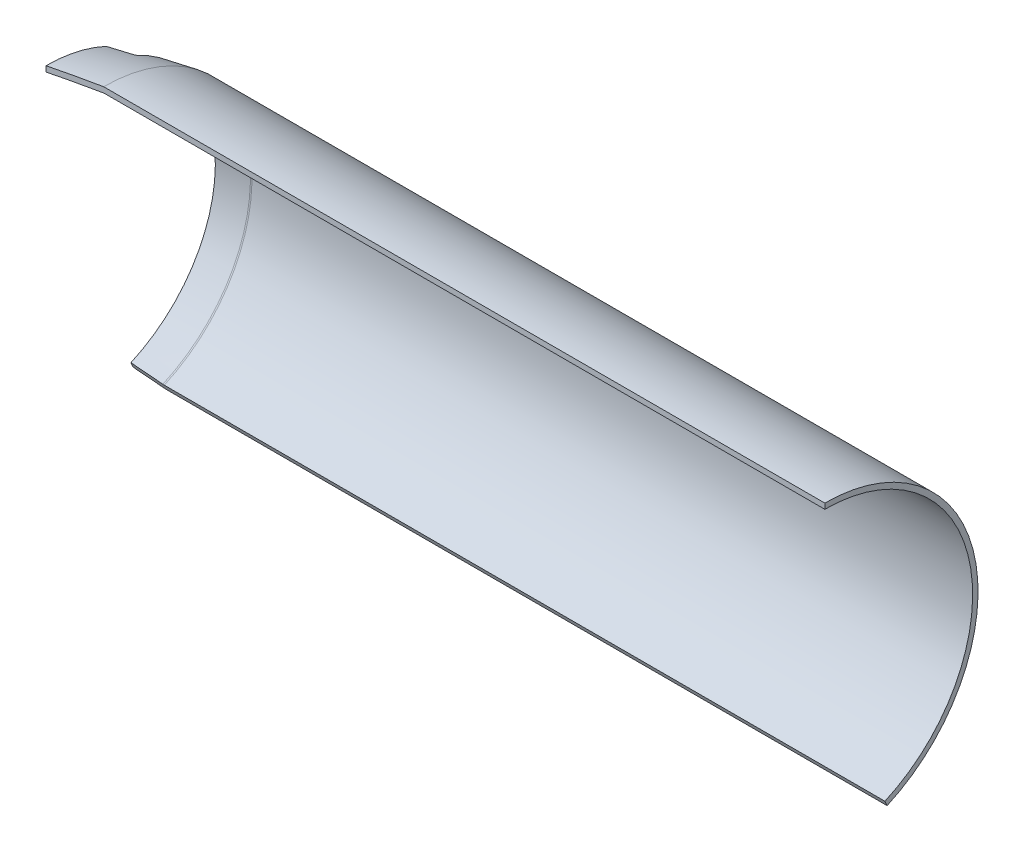
ISO-10303-21;
HEADER;
FILE_DESCRIPTION(('STEP AP214'),'2;1');
FILE_NAME('part.step','',(''),(''),'','','');
FILE_SCHEMA(('AUTOMOTIVE_DESIGN { 1 0 10303 214 1 1 1 1 }'));
ENDSEC;
DATA;
#1=APPLICATION_CONTEXT('core data for automotive mechanical design processes');
#2=APPLICATION_PROTOCOL_DEFINITION('international standard','automotive_design',2000,#1);
#3=PRODUCT_CONTEXT('',#1,'mechanical');
#4=PRODUCT('Part','Part','',(#3));
#5=PRODUCT_RELATED_PRODUCT_CATEGORY('part','',(#4));
#6=PRODUCT_DEFINITION_FORMATION('','',#4);
#7=PRODUCT_DEFINITION_CONTEXT('part definition',#1,'design');
#8=PRODUCT_DEFINITION('design','',#6,#7);
#9=PRODUCT_DEFINITION_SHAPE('','',#8);
#10=(LENGTH_UNIT() NAMED_UNIT(*) SI_UNIT(.MILLI.,.METRE.));
#11=(NAMED_UNIT(*) PLANE_ANGLE_UNIT() SI_UNIT($,.RADIAN.));
#12=(NAMED_UNIT(*) SI_UNIT($,.STERADIAN.) SOLID_ANGLE_UNIT());
#13=UNCERTAINTY_MEASURE_WITH_UNIT(LENGTH_MEASURE(1.E-05),#10,'distance_accuracy_value','');
#14=(GEOMETRIC_REPRESENTATION_CONTEXT(3) GLOBAL_UNCERTAINTY_ASSIGNED_CONTEXT((#13)) GLOBAL_UNIT_ASSIGNED_CONTEXT((#10,
#11,#12)) REPRESENTATION_CONTEXT('',''));
#15=CARTESIAN_POINT('',(0.,0.,0.));
#16=DIRECTION('',(0.,0.,1.));
#17=DIRECTION('',(1.,0.,0.));
#18=AXIS2_PLACEMENT_3D('',#15,#16,#17);
#19=CARTESIAN_POINT('',(2.99998502922989,-0.0086581940792753,-0.00385487636706184));
#20=CARTESIAN_POINT('',(2.99378515333313,-1.80147160510427,-0.802066834361219));
#21=CARTESIAN_POINT('',(2.98195040978965,-5.40732685147011,-2.40749702511354));
#22=CARTESIAN_POINT('',(3.14536866129644,-10.6948313776654,-4.76164571387436));
#23=CARTESIAN_POINT('',(3.67380568909732,-15.848602483148,-7.05625244754946));
#24=CARTESIAN_POINT('',(4.82699544242553,-20.7904765554686,-9.25651654372908));
#25=CARTESIAN_POINT('',(6.76738537381217,-25.4412473261416,-11.3271730996272));
#26=CARTESIAN_POINT('',(10.4622641517895,-31.1574483104251,-13.872189748819));
#27=CARTESIAN_POINT('',(16.9322549212883,-37.2807506856433,-16.598459615084));
#28=CARTESIAN_POINT('',(26.3776177431232,-43.172920300978,-19.2218225465344));
#29=CARTESIAN_POINT('',(36.6730106596153,-48.0271968024729,-21.383085691419));
#30=CARTESIAN_POINT('',(47.4413847705489,-52.1461336459121,-23.2169545270923));
#31=CARTESIAN_POINT('',(62.1774895395736,-56.9233592318811,-25.3439123941555));
#32=CARTESIAN_POINT('',(81.0422134548498,-61.8995926823209,-27.5594742710832));
#33=CARTESIAN_POINT('',(100.366537787101,-66.0958567747539,-29.4277714161645));
#34=CARTESIAN_POINT('',(113.339959999299,-68.6040230253226,-30.5444789784404));
#35=CARTESIAN_POINT('',(119.234150764897,-69.6904911734504,-31.028205763661));
#36=CARTESIAN_POINT('',(121.704625197121,-70.1385095968566,-31.2276764173081));
#37=CARTESIAN_POINT('',(124.176300874029,-70.5819465135537,-31.4251072527464));
#38=CARTESIAN_POINT('',(126.669706293393,-71.0222217401091,-31.6211304130396));
#39=CARTESIAN_POINT('',(129.184778355444,-71.4594725302961,-31.8158070075047));
#40=CARTESIAN_POINT('',(131.727646248652,-71.8969502373023,-32.0105846318468));
#41=CARTESIAN_POINT('',(136.026266358756,-72.6251882236422,-32.3348170730967));
#42=CARTESIAN_POINT('',(142.085775201191,-73.6226820540156,-32.7789299397972));
#43=CARTESIAN_POINT('',(147.046954444728,-74.4106787926832,-33.1297686917816));
#44=CARTESIAN_POINT('',(149.853420334703,-74.8485371499289,-33.3247157925294));
#45=CARTESIAN_POINT('',(150.25949387089,-74.9116973185173,-33.3528365113539));
#46=CARTESIAN_POINT('',(150.502918144044,-74.9495119580345,-33.3696726735916));
#47=B_SPLINE_CURVE_WITH_KNOTS('',3,(#19,#20,#21,#22,#23,#24,#25,#26,#27,#28,#29,#30,#31,#32,#33,
#34,#35,#36,#37,#38,#39,#40,#41,#42,#43,#44,#45,#46),.UNSPECIFIED.,.F.,.F.,(4,1,1,1,1,1,1,1,1,1,
1,1,1,1,1,1,1,1,1,1,1,1,1,1,1,4),(0.,0.03125,0.0625,0.09375,0.125,0.15625,0.1875,0.25,0.3125,
0.375,0.4375,0.5,0.625,0.75,0.815400458452748,0.835368339959979,0.845352280713594,
0.855336221467209,0.87530410297444,0.885611055109122,0.895918007243803,0.916316570592456,
0.954897809118897,0.993479047645339,0.996087428587203,1.),.UNSPECIFIED.);
#48=CARTESIAN_POINT('',(3.00001497084482,0.,0.));
#49=DIRECTION('',(1.,0.,0.));
#50=AXIS1_PLACEMENT('',#48,#49);
#51=SURFACE_OF_REVOLUTION('',#47,#50);
#52=CARTESIAN_POINT('',(149.528816254368,0.,0.));
#53=DIRECTION('',(1.,0.,0.));
#54=DIRECTION('',(0.,-0.913545457642603,-0.406736643075795));
#55=AXIS2_PLACEMENT_3D('',#52,#53,#54);
#56=CIRCLE('',#55,81.8764792022982);
#57=CARTESIAN_POINT('',(149.52881443502,-74.7978953952405,-33.3021686306678));
#58=VERTEX_POINT('',#57);
#59=CARTESIAN_POINT('',(149.52881443502,81.8764898555304,0.));
#60=VERTEX_POINT('',#59);
#61=EDGE_CURVE('E11',#58,#60,#56,.T.);
#62=ORIENTED_EDGE('',*,*,#61,.T.);
#63=CARTESIAN_POINT('',(2.99998502922989,0.00947757334552098,0.));
#64=CARTESIAN_POINT('',(2.99378515333313,1.97195617364565,0.));
#65=CARTESIAN_POINT('',(2.98195040978965,5.91905614135904,0.));
#66=CARTESIAN_POINT('',(3.14536866129644,11.7069504184973,0.));
#67=CARTESIAN_POINT('',(3.67380568909732,17.3484552416747,0.));
#68=CARTESIAN_POINT('',(4.82699544242553,22.7580098850453,0.));
#69=CARTESIAN_POINT('',(6.76738537381217,27.8489122936395,0.));
#70=CARTESIAN_POINT('',(10.4622641517895,34.1060732662681,0.));
#71=CARTESIAN_POINT('',(16.9322549212883,40.8088621904442,0.));
#72=CARTESIAN_POINT('',(26.3776177431232,47.2586448105006,0.));
#73=CARTESIAN_POINT('',(36.6730106596153,52.5723119749363,0.));
#74=CARTESIAN_POINT('',(47.4413847705489,57.08104967264,0.));
#75=CARTESIAN_POINT('',(62.1774895395736,62.310374109649,0.));
#76=CARTESIAN_POINT('',(81.0422134548498,67.7575397748157,0.));
#77=CARTESIAN_POINT('',(100.366537787101,72.3509226845851,0.));
#78=CARTESIAN_POINT('',(113.339959999299,75.0964524549821,0.));
#79=CARTESIAN_POINT('',(119.234150764897,76.2857399053641,0.));
#80=CARTESIAN_POINT('',(121.704625197121,76.7761571250635,0.));
#81=CARTESIAN_POINT('',(124.176300874029,77.2615592613091,0.));
#82=CARTESIAN_POINT('',(126.669706293393,77.7435004968241,0.));
#83=CARTESIAN_POINT('',(129.184778355444,78.2221310745682,0.));
#84=CARTESIAN_POINT('',(131.727646248652,78.7010100436948,0.));
#85=CARTESIAN_POINT('',(136.026266358756,79.4981657629286,0.));
#86=CARTESIAN_POINT('',(142.085775201191,80.5900586972414,0.));
#87=CARTESIAN_POINT('',(147.046954444728,81.4526285147314,0.));
#88=CARTESIAN_POINT('',(149.853420334703,81.9319241574195,0.));
#89=CARTESIAN_POINT('',(150.25949387089,82.001061569313,0.));
#90=CARTESIAN_POINT('',(150.502918144044,82.0424548455871,0.));
#91=B_SPLINE_CURVE_WITH_KNOTS('',3,(#63,#64,#65,#66,#67,#68,#69,#70,#71,#72,#73,#74,#75,#76,#77,
#78,#79,#80,#81,#82,#83,#84,#85,#86,#87,#88,#89,#90),.UNSPECIFIED.,.F.,.F.,(4,1,1,1,1,1,1,1,1,1,
1,1,1,1,1,1,1,1,1,1,1,1,1,1,1,4),(0.,0.03125,0.0625,0.09375,0.125,0.15625,0.1875,0.25,0.3125,
0.375,0.4375,0.5,0.625,0.75,0.815400458452748,0.835368339959979,0.845352280713594,
0.855336221467209,0.87530410297444,0.885611055109122,0.895918007243803,0.916316570592456,
0.954897809118897,0.993479047645339,0.996087428587203,1.),.UNSPECIFIED.);
#92=CARTESIAN_POINT('',(133.,78.936371339794,0.));
#93=VERTEX_POINT('',#92);
#94=EDGE_CURVE('E142',#93,#60,#91,.T.);
#95=ORIENTED_EDGE('',*,*,#94,.F.);
#96=CARTESIAN_POINT('',(132.999991524732,0.,0.));
#97=DIRECTION('',(1.,0.,0.));
#98=DIRECTION('',(0.,0.906307787036649,-0.4226182617407));
#99=AXIS2_PLACEMENT_3D('',#96,#97,#98);
#100=CIRCLE('',#99,78.9364170314981);
#101=CARTESIAN_POINT('',(133.,71.5406480256719,-33.3599520437422));
#102=VERTEX_POINT('',#101);
#103=EDGE_CURVE('E208',#102,#93,#100,.T.);
#104=ORIENTED_EDGE('',*,*,#103,.F.);
#105=CARTESIAN_POINT('',(133.,0.,0.));
#106=DIRECTION('',(-1.,0.,0.));
#107=DIRECTION('',(0.,0.906307787037048,-0.422618261739846));
#108=AXIS2_PLACEMENT_3D('',#105,#106,#107);
#109=CIRCLE('',#108,78.936371339794);
#110=CARTESIAN_POINT('',(133.,-72.1119634802586,-32.1063146953322));
#111=VERTEX_POINT('',#110);
#112=EDGE_CURVE('E64',#111,#102,#109,.F.);
#113=ORIENTED_EDGE('',*,*,#112,.F.);
#114=EDGE_CURVE('E275',#111,#58,#47,.T.);
#115=ORIENTED_EDGE('',*,*,#114,.T.);
#116=EDGE_LOOP('',(#62,#95,#104,#113,#115));
#117=FACE_BOUND('',#116,.T.);
#118=ADVANCED_FACE('F39',(#117),#51,.F.);
#119=CARTESIAN_POINT('',(149.52881443502,0.,0.));
#120=DIRECTION('',(1.,0.,0.));
#121=DIRECTION('',(0.,0.,-1.));
#122=AXIS2_PLACEMENT_3D('',#119,#120,#121);
#123=CONICAL_SURFACE('',#122,81.8764898555304,0.168851339184837);
#124=CARTESIAN_POINT('',(150.253322265216,0.,0.));
#125=DIRECTION('',(1.,0.,0.));
#126=DIRECTION('',(0.,-0.913545457642604,-0.406736643075794));
#127=AXIS2_PLACEMENT_3D('',#124,#125,#126);
#128=CIRCLE('',#127,81.9999999999975);
#129=CARTESIAN_POINT('',(150.253322265216,-74.9107275266912,-33.3524047322141));
#130=VERTEX_POINT('',#129);
#131=CARTESIAN_POINT('',(150.253322265216,81.9999999999975,0.));
#132=VERTEX_POINT('',#131);
#133=EDGE_CURVE('E50',#130,#132,#128,.T.);
#134=ORIENTED_EDGE('',*,*,#133,.T.);
#135=CARTESIAN_POINT('',(149.52881443502,81.8764898555304,0.));
#136=DIRECTION('',(0.985778449800939,0.168050135102762,0.));
#137=VECTOR('',#136,1.);
#138=LINE('',#135,#137);
#139=EDGE_CURVE('E244',#60,#132,#138,.T.);
#140=ORIENTED_EDGE('',*,*,#139,.F.);
#141=ORIENTED_EDGE('',*,*,#61,.F.);
#142=CARTESIAN_POINT('',(149.52881443502,-74.7978953952405,-33.3021686306677));
#143=DIRECTION('',(0.985778449800939,-0.153521437579357,-0.0683521478201298));
#144=VECTOR('',#143,1.);
#145=LINE('',#142,#144);
#146=EDGE_CURVE('E281',#58,#130,#145,.T.);
#147=ORIENTED_EDGE('',*,*,#146,.T.);
#148=EDGE_LOOP('',(#134,#140,#141,#147));
#149=FACE_BOUND('',#148,.T.);
#150=ADVANCED_FACE('F41',(#149),#123,.F.);
#151=CARTESIAN_POINT('',(3.00001497084482,0.,0.));
#152=DIRECTION('',(1.,0.,0.));
#153=DIRECTION('',(0.,0.,-1.));
#154=AXIS2_PLACEMENT_3D('',#151,#152,#153);
#155=CYLINDRICAL_SURFACE('',#154,81.9999999999987);
#156=CARTESIAN_POINT('',(550.,0.,0.));
#157=DIRECTION('',(1.,0.,0.));
#158=DIRECTION('',(0.,0.,-1.));
#159=AXIS2_PLACEMENT_3D('',#156,#157,#158);
#160=CIRCLE('',#159,82.);
#161=CARTESIAN_POINT('',(550.,-74.9107275266935,-33.3524047322152));
#162=VERTEX_POINT('',#161);
#163=CARTESIAN_POINT('',(550.,82.,0.));
#164=VERTEX_POINT('',#163);
#165=EDGE_CURVE('E410',#162,#164,#160,.T.);
#166=ORIENTED_EDGE('',*,*,#165,.T.);
#167=DIRECTION('',(1.,0.,0.));
#168=VECTOR('',#167,1.);
#169=CARTESIAN_POINT('',(-5.20955133446338E-13,81.9999999999965,0.));
#170=LINE('',#169,#168);
#171=EDGE_CURVE('E370',#132,#164,#170,.T.);
#172=ORIENTED_EDGE('',*,*,#171,.F.);
#173=ORIENTED_EDGE('',*,*,#133,.F.);
#174=DIRECTION('',(1.,0.,0.));
#175=VECTOR('',#174,1.);
#176=CARTESIAN_POINT('',(-5.20955133446338E-13,-74.9107275266903,-33.3524047322137));
#177=LINE('',#176,#175);
#178=EDGE_CURVE('E287',#130,#162,#177,.T.);
#179=ORIENTED_EDGE('',*,*,#178,.T.);
#180=EDGE_LOOP('',(#166,#172,#173,#179));
#181=FACE_BOUND('',#180,.T.);
#182=ADVANCED_FACE('F325',(#181),#155,.F.);
#183=CARTESIAN_POINT('',(550.,0.,0.));
#184=DIRECTION('',(-1.,0.,0.));
#185=DIRECTION('',(0.,0.,1.));
#186=AXIS2_PLACEMENT_3D('',#183,#184,#185);
#187=PLANE('',#186);
#188=CARTESIAN_POINT('',(550.,0.,0.));
#189=DIRECTION('',(1.,0.,0.));
#190=DIRECTION('',(0.,0.,-1.));
#191=AXIS2_PLACEMENT_3D('',#188,#189,#190);
#192=CIRCLE('',#191,85.);
#193=CARTESIAN_POINT('',(550.,-77.6513638996213,-34.5726146614426));
#194=VERTEX_POINT('',#193);
#195=CARTESIAN_POINT('',(550.,85.,0.));
#196=VERTEX_POINT('',#195);
#197=EDGE_CURVE('E412',#194,#196,#192,.T.);
#198=ORIENTED_EDGE('',*,*,#197,.T.);
#199=DIRECTION('',(0.,-1.,0.));
#200=VECTOR('',#199,1.);
#201=CARTESIAN_POINT('',(550.,0.,0.));
#202=LINE('',#201,#200);
#203=EDGE_CURVE('E371',#196,#164,#202,.T.);
#204=ORIENTED_EDGE('',*,*,#203,.T.);
#205=ORIENTED_EDGE('',*,*,#165,.F.);
#206=DIRECTION('',(0.,0.913545457642603,0.406736643075795));
#207=VECTOR('',#206,1.);
#208=CARTESIAN_POINT('',(550.,0.,0.));
#209=LINE('',#208,#207);
#210=EDGE_CURVE('E294',#194,#162,#209,.T.);
#211=ORIENTED_EDGE('',*,*,#210,.F.);
#212=EDGE_LOOP('',(#198,#204,#205,#211));
#213=FACE_BOUND('',#212,.T.);
#214=ADVANCED_FACE('F322',(#213),#187,.F.);
#215=CARTESIAN_POINT('',(3.00001497084482,0.,0.));
#216=DIRECTION('',(1.,0.,0.));
#217=DIRECTION('',(0.,0.,-1.));
#218=AXIS2_PLACEMENT_3D('',#215,#216,#217);
#219=CYLINDRICAL_SURFACE('',#218,85.);
#220=CARTESIAN_POINT('',(150.,0.,0.));
#221=DIRECTION('',(1.,0.,0.));
#222=DIRECTION('',(0.,0.,-1.));
#223=AXIS2_PLACEMENT_3D('',#220,#221,#222);
#224=CIRCLE('',#223,85.);
#225=CARTESIAN_POINT('',(150.,-77.6513638996213,-34.5726146614426));
#226=VERTEX_POINT('',#225);
#227=CARTESIAN_POINT('',(150.,85.,0.));
#228=VERTEX_POINT('',#227);
#229=EDGE_CURVE('E414',#226,#228,#224,.T.);
#230=ORIENTED_EDGE('',*,*,#229,.T.);
#231=DIRECTION('',(1.,0.,0.));
#232=VECTOR('',#231,1.);
#233=CARTESIAN_POINT('',(0.,85.,0.));
#234=LINE('',#233,#232);
#235=EDGE_CURVE('E428',#228,#196,#234,.T.);
#236=ORIENTED_EDGE('',*,*,#235,.T.);
#237=ORIENTED_EDGE('',*,*,#197,.F.);
#238=DIRECTION('',(1.,0.,0.));
#239=VECTOR('',#238,1.);
#240=CARTESIAN_POINT('',(0.,-77.6513638996213,-34.5726146614426));
#241=LINE('',#240,#239);
#242=EDGE_CURVE('E299',#226,#194,#241,.T.);
#243=ORIENTED_EDGE('',*,*,#242,.F.);
#244=EDGE_LOOP('',(#230,#236,#237,#243));
#245=FACE_BOUND('',#244,.T.);
#246=ADVANCED_FACE('F317',(#245),#219,.T.);
#247=CARTESIAN_POINT('',(0.,0.,0.));
#248=CARTESIAN_POINT('',(-0.01229422515827,-3.55511176496774,-1.58283773724147));
#249=CARTESIAN_POINT('',(-0.0274375794679944,-7.93410404585678,-3.5324907134379));
#250=CARTESIAN_POINT('',(0.361573767311703,-12.8679476771951,-5.72917942693652));
#251=CARTESIAN_POINT('',(0.57609845251901,-14.6993996993189,-6.54459440295232));
#252=CARTESIAN_POINT('',(0.782493434811414,-16.0828053429504,-7.1605262789148));
#253=CARTESIAN_POINT('',(0.986227589019432,-17.2242589015483,-7.66873414615009));
#254=CARTESIAN_POINT('',(1.1886708633946,-18.2083650680839,-8.10688644088076));
#255=CARTESIAN_POINT('',(1.39040426817789,-19.0800174760884,-8.49497109654259));
#256=CARTESIAN_POINT('',(1.59169883745854,-19.8664428705453,-8.84511024100987));
#257=CARTESIAN_POINT('',(1.79270386413704,-20.5856013631755,-9.16530023121209));
#258=CARTESIAN_POINT('',(1.99350716667378,-21.2500575018277,-9.46113516426941));
#259=CARTESIAN_POINT('',(2.25380855212399,-22.0529685802024,-9.81861420811379));
#260=CARTESIAN_POINT('',(2.58057365558414,-22.9721741122674,-10.2278708786834));
#261=CARTESIAN_POINT('',(2.98358538597319,-23.9892479986476,-10.6807013479781));
#262=CARTESIAN_POINT('',(3.38587909275829,-24.9135372748452,-11.0922214472644));
#263=CARTESIAN_POINT('',(3.78768343871713,-25.7634134259782,-11.4706106887084));
#264=CARTESIAN_POINT('',(4.18913861433532,-26.5520319568076,-11.8217262803995));
#265=CARTESIAN_POINT('',(4.59033561481038,-27.2891804892807,-12.1499259523896));
#266=CARTESIAN_POINT('',(5.05331092004136,-28.0894954457932,-12.5062491283104));
#267=CARTESIAN_POINT('',(5.58321858881817,-28.9442783015306,-12.8868229753947));
#268=CARTESIAN_POINT('',(6.18542963153958,-29.8452857201268,-13.2879773238295));
#269=CARTESIAN_POINT('',(6.78722692689446,-30.6865621985085,-13.6625377442803));
#270=CARTESIAN_POINT('',(7.45148151123188,-31.5594281280081,-14.051162694522));
#271=CARTESIAN_POINT('',(8.18277044424618,-32.4591504440959,-14.4517448784566));
#272=CARTESIAN_POINT('',(8.98508387628335,-33.3809632738905,-14.8621623927666));
#273=CARTESIAN_POINT('',(9.85034460299619,-34.3150380595977,-15.2780392815868));
#274=CARTESIAN_POINT('',(10.7826088420303,-35.2589689373153,-15.6983043852951));
#275=CARTESIAN_POINT('',(11.7850117433407,-36.210135586101,-16.1217910618433));
#276=CARTESIAN_POINT('',(12.8510297890443,-37.1633510341562,-16.5461899225967));
#277=CARTESIAN_POINT('',(13.9839603207363,-38.1173472770922,-16.9709364156284));
#278=CARTESIAN_POINT('',(15.1861706225691,-39.070689583869,-17.3953917575236));
#279=CARTESIAN_POINT('',(16.3879753215997,-39.9724507440697,-17.7968816933421));
#280=CARTESIAN_POINT('',(17.6543809034163,-40.8752274061168,-18.1988237597126));
#281=CARTESIAN_POINT('',(18.9876022764676,-41.777778454745,-18.6006653765171));
#282=CARTESIAN_POINT('',(20.3891988556301,-42.6789170874951,-19.0018781452572));
#283=CARTESIAN_POINT('',(21.7905220441791,-43.5376231361854,-19.384198710382));
#284=CARTESIAN_POINT('',(23.2571035986549,-44.3968175589445,-19.7667367136515));
#285=CARTESIAN_POINT('',(24.790441055548,-45.2553850904317,-20.1489956069441));
#286=CARTESIAN_POINT('',(26.3915877567857,-46.1123445678181,-20.5305385484236));
#287=CARTESIAN_POINT('',(28.0582927499576,-46.9673486735486,-20.9112109023513));
#288=CARTESIAN_POINT('',(29.7917203934432,-47.8195887335426,-21.2906526238297));
#289=CARTESIAN_POINT('',(31.5926828604072,-48.668389747695,-21.6685631834493));
#290=CARTESIAN_POINT('',(33.4594457975844,-49.5138243571845,-22.0449749231467));
#291=CARTESIAN_POINT('',(35.3929098213764,-50.3552892634014,-22.4196192370749));
#292=CARTESIAN_POINT('',(37.4597469179254,-51.2199369901545,-22.8045852077122));
#293=CARTESIAN_POINT('',(39.5932702297775,-52.0780863931112,-23.1866579381889));
#294=CARTESIAN_POINT('',(41.8601513478097,-52.9551165333492,-23.577136914503));
#295=CARTESIAN_POINT('',(44.193707143034,-53.8238344488824,-23.9639150499398));
#296=CARTESIAN_POINT('',(46.6606093325559,-54.7079627813331,-24.3575543450409));
#297=CARTESIAN_POINT('',(49.2604049333765,-55.6053828015337,-24.7571114808044));
#298=CARTESIAN_POINT('',(51.9940338099678,-56.5134487325718,-25.1614084814539));
#299=CARTESIAN_POINT('',(54.8609921874534,-57.4305980333945,-25.5697496588908));
#300=CARTESIAN_POINT('',(57.7946028227797,-58.3349484607198,-25.9723924107071));
#301=CARTESIAN_POINT('',(60.8615392806008,-59.2466874489917,-26.3783247617999));
#302=CARTESIAN_POINT('',(64.0614958695097,-60.1646242238145,-26.7870165452506));
#303=CARTESIAN_POINT('',(67.4614975977933,-61.1053808898448,-27.2058683988625));
#304=CARTESIAN_POINT('',(70.9951359048108,-62.0482219331216,-27.6256482770156));
#305=CARTESIAN_POINT('',(74.6620888756832,-62.9925388918716,-28.0460852750744));
#306=CARTESIAN_POINT('',(78.46213040735,-63.9377456407347,-28.4669184332154));
#307=CARTESIAN_POINT('',(82.4621970688495,-64.8986676277649,-28.8947484661849));
#308=CARTESIAN_POINT('',(86.6622846143895,-65.8731138386316,-29.328599871553));
#309=CARTESIAN_POINT('',(91.0623885711703,-66.8591050442723,-29.7675914397662));
#310=CARTESIAN_POINT('',(95.6625052522908,-67.8548574237632,-30.2109289625798));
#311=CARTESIAN_POINT('',(100.46263128834,-68.8587681219163,-30.6578988028857));
#312=CARTESIAN_POINT('',(105.462763855211,-69.8693998114377,-31.1078610213424));
#313=CARTESIAN_POINT('',(110.662900526555,-70.8854662965331,-31.5602429666875));
#314=CARTESIAN_POINT('',(116.063039295925,-71.9058185381736,-32.0145330537847));
#315=CARTESIAN_POINT('',(121.663178505039,-72.9294316644856,-32.4702749802772));
#316=CARTESIAN_POINT('',(127.529872228265,-73.9671655284965,-32.9323038642509));
#317=CARTESIAN_POINT('',(133.663251007027,-75.0168954294794,-33.3996737279945));
#318=CARTESIAN_POINT('',(140.063409966275,-76.0767336773354,-33.8715441177271));
#319=CARTESIAN_POINT('',(145.198462088796,-76.8998954161564,-34.2380393364987));
#320=CARTESIAN_POINT('',(148.333178957117,-77.3917697124478,-34.4570358827736));
#321=CARTESIAN_POINT('',(149.399989369755,-77.5580695611595,-34.5310773457825));
#322=CARTESIAN_POINT('',(149.733326586977,-77.6099376324229,-34.5541704989606));
#323=CARTESIAN_POINT('',(149.933332963086,-77.6410075373083,-34.5680037118653));
#324=CARTESIAN_POINT('',(150.,-77.6513638996213,-34.5726146614426));
#325=B_SPLINE_CURVE_WITH_KNOTS('',3,(#247,#248,#249,#250,#251,#252,#253,#254,#255,#256,#257,
#258,#259,#260,#261,#262,#263,#264,#265,#266,#267,#268,#269,#270,#271,#272,#273,#274,#275,#276,
#277,#278,#279,#280,#281,#282,#283,#284,#285,#286,#287,#288,#289,#290,#291,#292,#293,#294,#295,
#296,#297,#298,#299,#300,#301,#302,#303,#304,#305,#306,#307,#308,#309,#310,#311,#312,#313,#314,
#315,#316,#317,#318,#319,#320,#321,#322,#323,#324),.UNSPECIFIED.,.F.,.F.,(4,1,1,1,1,1,1,1,1,1,1,
1,1,1,1,1,1,1,1,1,1,1,1,1,1,1,1,1,1,1,1,1,1,1,1,1,1,1,1,1,1,1,1,1,1,1,1,1,1,1,1,1,1,1,1,1,1,1,1,
1,1,1,1,1,1,1,1,1,1,1,1,1,1,1,1,4),(0.,0.0614622085480882,0.0757057877759612,0.0855484370022001,
0.0933219351485794,0.0998563327569883,0.105553796923936,0.110642994701401,0.115267653693258,
0.119524592032341,0.123482434328793,0.127191759236467,0.13401018143711,0.140199135809593,
0.145901383655058,0.151215492677633,0.156212588029745,0.160945789212141,0.165455878222834,
0.171870938021455,0.177937367660151,0.183716424531889,0.189254732016856,0.196326298367593,
0.203099892278393,0.209625632356298,0.217492531966611,0.225090540892236,0.232464167327681,
0.241064619848248,0.249438141881291,0.257620809315702,0.265641058489813,0.274822876423717,
0.283843410345531,0.292725747489478,0.301488561153658,0.311376344682328,0.321146599326774,
0.330814588730179,0.341584449391012,0.352255607865541,0.362840299084411,0.374512001143992,
0.386101174085339,0.398765505354977,0.411352525887495,0.425006218129689,0.438588433261056,
0.453231338970534,0.4689276029869,0.484557056650177,0.501237455688265,0.517857888960219,
0.535527768513025,0.554243231333738,0.574001114575082,0.593705628285817,0.614453398954075,
0.636242372849008,0.659070930227713,0.682937828796564,0.707842150724176,0.733783254098978,
0.7607607292546,0.78877436004904,0.817824089953741,0.847909992662372,0.879032246845277,
0.912262482342555,0.946527454031209,0.981827786313507,0.994656091747925,0.996793739816064,
0.998931274741357,1.),.UNSPECIFIED.);
#326=CARTESIAN_POINT('',(3.00001497084482,0.,0.));
#327=DIRECTION('',(1.,0.,0.));
#328=AXIS1_PLACEMENT('',#326,#327);
#329=SURFACE_OF_REVOLUTION('',#325,#328);
#330=CARTESIAN_POINT('',(133.,0.,0.));
#331=DIRECTION('',(1.,0.,0.));
#332=DIRECTION('',(0.,0.,-1.));
#333=AXIS2_PLACEMENT_3D('',#330,#331,#332);
#334=CIRCLE('',#333,81.9873862467777);
#335=CARTESIAN_POINT('',(133.,-74.8992042897334,-33.347274256573));
#336=VERTEX_POINT('',#335);
#337=CARTESIAN_POINT('',(133.000000000002,74.3058065942362,-34.6493666602766));
#338=VERTEX_POINT('',#337);
#339=EDGE_CURVE('E416',#336,#338,#334,.T.);
#340=ORIENTED_EDGE('',*,*,#339,.T.);
#341=CARTESIAN_POINT('',(0.,0.,0.));
#342=CARTESIAN_POINT('',(-0.01229422515827,3.52694597671175,-1.64464191883965));
#343=CARTESIAN_POINT('',(-0.0274375794679944,7.87124517971403,-3.67042190651628));
#344=CARTESIAN_POINT('',(0.361573767311703,12.7659998585255,-5.95288349803609));
#345=CARTESIAN_POINT('',(0.57609845251901,14.582941988059,-6.80013752746199));
#346=CARTESIAN_POINT('',(0.782493434811414,15.9553874388734,-7.44011935157673));
#347=CARTESIAN_POINT('',(0.986227589019432,17.0877976983119,-7.96817092772622));
#348=CARTESIAN_POINT('',(1.1886708633946,18.0641071687827,-8.42343151053599));
#349=CARTESIAN_POINT('',(1.39040426817789,18.9288538087607,-8.82666949112156));
#350=CARTESIAN_POINT('',(1.59169883745854,19.7090486561621,-9.19048032331788));
#351=CARTESIAN_POINT('',(1.79270386413704,20.4225095316244,-9.52317259333993));
#352=CARTESIAN_POINT('',(1.99350716667378,21.0817014388983,-9.83055882789554));
#353=CARTESIAN_POINT('',(2.25380855212399,21.8782513604607,-10.2019961564229));
#354=CARTESIAN_POINT('',(2.58057365558414,22.7901743793189,-10.6272328437643));
#355=CARTESIAN_POINT('',(2.98358538597319,23.7991903790227,-11.0977447316271));
#356=CARTESIAN_POINT('',(3.38587909275829,24.7161568654567,-11.5253332265228));
#357=CARTESIAN_POINT('',(3.78768343871713,25.5592997735022,-11.9184972214634));
#358=CARTESIAN_POINT('',(4.18913861433532,26.341670381897,-12.2833226276733));
#359=CARTESIAN_POINT('',(4.59033561481038,27.0729787690099,-12.6243373290571));
#360=CARTESIAN_POINT('',(5.05331092004136,27.866953136789,-12.9945736571312));
#361=CARTESIAN_POINT('',(5.58321858881817,28.7149638754986,-13.3900075587891));
#362=CARTESIAN_POINT('',(6.18542963153958,29.6088329575678,-13.806825557146));
#363=CARTESIAN_POINT('',(6.78722692689446,30.4434443247739,-14.1960112292574));
#364=CARTESIAN_POINT('',(7.45148151123188,31.3093948719814,-14.5998106010038));
#365=CARTESIAN_POINT('',(8.18277044424618,32.201989032917,-15.0160340938725));
#366=CARTESIAN_POINT('',(8.98508387628335,33.116498692884,-15.4424769517718));
#367=CARTESIAN_POINT('',(9.85034460299619,34.0431731619855,-15.8745923533306));
#368=CARTESIAN_POINT('',(10.7826088420303,34.979625637057,-16.3112673139546));
#369=CARTESIAN_POINT('',(11.7850117433407,35.9232565569551,-16.751289638375));
#370=CARTESIAN_POINT('',(12.8510297890443,36.8689200442712,-17.192259764548));
#371=CARTESIAN_POINT('',(13.9839603207363,37.8153581405294,-17.6335910968029));
#372=CARTESIAN_POINT('',(15.1861706225691,38.7611474815141,-18.0746199095054));
#373=CARTESIAN_POINT('',(16.3879753215997,39.6557643335818,-18.4917865987391));
#374=CARTESIAN_POINT('',(17.6543809034163,40.5513886420641,-18.9094230726142));
#375=CARTESIAN_POINT('',(18.9876022764676,41.4467891245761,-19.3269551747252));
#376=CARTESIAN_POINT('',(20.3891988556301,42.3407883812398,-19.7438338744924));
#377=CARTESIAN_POINT('',(21.7905220441791,43.1926912309478,-20.1410826973153));
#378=CARTESIAN_POINT('',(23.2571035986549,44.0450785855239,-20.5385574484686));
#379=CARTESIAN_POINT('',(24.790441055548,44.8968440154474,-20.9357421913936));
#380=CARTESIAN_POINT('',(26.3915877567857,45.7470141312668,-21.3321830271347));
#381=CARTESIAN_POINT('',(28.0582927499576,46.5952443670904,-21.7277192819779));
#382=CARTESIAN_POINT('',(29.7917203934432,47.4407324556529,-22.1219768525534));
#383=CARTESIAN_POINT('',(31.5926828604072,48.2828087446161,-22.5146434748477));
#384=CARTESIAN_POINT('',(33.4594457975844,49.1215452996507,-22.9057527536348));
#385=CARTESIAN_POINT('',(35.3929098213764,49.9563436018505,-23.2950255949654));
#386=CARTESIAN_POINT('',(37.4597469179254,50.8141410559828,-23.6950231169732));
#387=CARTESIAN_POINT('',(39.5932702297775,51.6654916700479,-24.0920144280867));
#388=CARTESIAN_POINT('',(41.8601513478097,52.5355734365478,-24.4977402190266));
#389=CARTESIAN_POINT('',(44.193707143034,53.397408832914,-24.8996206644212));
#390=CARTESIAN_POINT('',(46.6606093325559,54.2745325553695,-25.3086301733517));
#391=CARTESIAN_POINT('',(49.2604049333765,55.164842660626,-25.7237885935655));
#392=CARTESIAN_POINT('',(51.9940338099678,56.0657143332478,-26.143871953524));
#393=CARTESIAN_POINT('',(54.8609921874534,56.9755974115959,-26.5681574009833));
#394=CARTESIAN_POINT('',(57.7946028227797,57.8727830170171,-26.9865219195777));
#395=CARTESIAN_POINT('',(60.8615392806008,58.7772986466477,-27.4083044845953));
#396=CARTESIAN_POINT('',(64.0614958695097,59.6879629601412,-27.8329542279858));
#397=CARTESIAN_POINT('',(67.4614975977933,60.6212663715883,-28.2681607561258));
#398=CARTESIAN_POINT('',(70.9951359048108,61.5566376465598,-28.7043315448632));
#399=CARTESIAN_POINT('',(74.6620888756832,62.4934731438917,-29.1411851117005));
#400=CARTESIAN_POINT('',(78.46213040735,63.4311913818705,-29.5784503072616));
#401=CARTESIAN_POINT('',(82.4621970688495,64.3845003522062,-30.022985580717));
#402=CARTESIAN_POINT('',(86.6622846143895,65.3512263991354,-30.473777339738));
#403=CARTESIAN_POINT('',(91.0623885711703,66.3294059742687,-30.9299099666735));
#404=CARTESIAN_POINT('',(95.6625052522908,67.3172693892122,-31.3905582422728));
#405=CARTESIAN_POINT('',(100.46263128834,68.3132264875851,-31.8549806644379));
#406=CARTESIAN_POINT('',(105.462763855211,69.3158513294872,-32.3225123064733));
#407=CARTESIAN_POINT('',(110.662900526555,70.3238679091604,-32.7925581571221));
#408=CARTESIAN_POINT('',(116.063039295925,71.3361362909719,-33.264586655669));
#409=CARTESIAN_POINT('',(121.663178505039,72.3516397227151,-33.7381236827735));
#410=CARTESIAN_POINT('',(127.529872228265,73.3811520189633,-34.2181931506788));
#411=CARTESIAN_POINT('',(133.663251007027,74.4225653121791,-34.7038121446098));
#412=CARTESIAN_POINT('',(140.063409966275,75.4740068677092,-35.1941073940558));
#413=CARTESIAN_POINT('',(145.198462088796,76.290647011495,-35.5749129470599));
#414=CARTESIAN_POINT('',(148.333178957117,76.7786243762147,-35.8024605292351));
#415=CARTESIAN_POINT('',(149.399989369755,76.9436066949482,-35.8793930479207));
#416=CARTESIAN_POINT('',(149.733326586977,76.995063835358,-35.9033879065605));
#417=CARTESIAN_POINT('',(149.933332963086,77.0258875852924,-35.917761257208));
#418=CARTESIAN_POINT('',(150.,77.0361618981152,-35.9225522479595));
#419=B_SPLINE_CURVE_WITH_KNOTS('',3,(#341,#342,#343,#344,#345,#346,#347,#348,#349,#350,#351,
#352,#353,#354,#355,#356,#357,#358,#359,#360,#361,#362,#363,#364,#365,#366,#367,#368,#369,#370,
#371,#372,#373,#374,#375,#376,#377,#378,#379,#380,#381,#382,#383,#384,#385,#386,#387,#388,#389,
#390,#391,#392,#393,#394,#395,#396,#397,#398,#399,#400,#401,#402,#403,#404,#405,#406,#407,#408,
#409,#410,#411,#412,#413,#414,#415,#416,#417,#418),.UNSPECIFIED.,.F.,.F.,(4,1,1,1,1,1,1,1,1,1,1,
1,1,1,1,1,1,1,1,1,1,1,1,1,1,1,1,1,1,1,1,1,1,1,1,1,1,1,1,1,1,1,1,1,1,1,1,1,1,1,1,1,1,1,1,1,1,1,1,
1,1,1,1,1,1,1,1,1,1,1,1,1,1,1,1,4),(0.,0.0614622085480882,0.0757057877759612,0.0855484370022001,
0.0933219351485794,0.0998563327569883,0.105553796923936,0.110642994701401,0.115267653693258,
0.119524592032341,0.123482434328793,0.127191759236467,0.13401018143711,0.140199135809593,
0.145901383655058,0.151215492677633,0.156212588029745,0.160945789212141,0.165455878222834,
0.171870938021455,0.177937367660151,0.183716424531889,0.189254732016856,0.196326298367593,
0.203099892278393,0.209625632356298,0.217492531966611,0.225090540892236,0.232464167327681,
0.241064619848248,0.249438141881291,0.257620809315702,0.265641058489813,0.274822876423717,
0.283843410345531,0.292725747489478,0.301488561153658,0.311376344682328,0.321146599326774,
0.330814588730179,0.341584449391012,0.352255607865541,0.362840299084411,0.374512001143992,
0.386101174085339,0.398765505354977,0.411352525887495,0.425006218129689,0.438588433261056,
0.453231338970534,0.4689276029869,0.484557056650177,0.501237455688265,0.517857888960219,
0.535527768513025,0.554243231333738,0.574001114575082,0.593705628285817,0.614453398954075,
0.636242372849008,0.659070930227713,0.682937828796564,0.707842150724176,0.733783254098978,
0.7607607292546,0.78877436004904,0.817824089953741,0.847909992662372,0.879032246845277,
0.912262482342555,0.946527454031209,0.981827786313507,0.994656091747925,0.996793739816064,
0.998931274741357,1.),.UNSPECIFIED.);
#420=CARTESIAN_POINT('',(118.,71.6855903843596,-33.4275397755893));
#421=VERTEX_POINT('',#420);
#422=EDGE_CURVE('E57',#421,#338,#419,.T.);
#423=ORIENTED_EDGE('',*,*,#422,.F.);
#424=CARTESIAN_POINT('',(118.,0.,0.));
#425=DIRECTION('',(1.,0.,0.));
#426=DIRECTION('',(0.,0.,-1.));
#427=AXIS2_PLACEMENT_3D('',#424,#425,#426);
#428=CIRCLE('',#427,79.0962975378924);
#429=CARTESIAN_POINT('',(118.,79.0962975378924,0.));
#430=VERTEX_POINT('',#429);
#431=EDGE_CURVE('E205',#421,#430,#428,.T.);
#432=ORIENTED_EDGE('',*,*,#431,.T.);
#433=CARTESIAN_POINT('',(0.,0.,0.));
#434=CARTESIAN_POINT('',(-0.01229422515827,3.89155431207734,0.));
#435=CARTESIAN_POINT('',(-0.0274375794679944,8.68495812603642,0.));
#436=CARTESIAN_POINT('',(0.361573767311703,14.0857223573754,0.));
#437=CARTESIAN_POINT('',(0.57609845251901,16.0904961831353,0.));
#438=CARTESIAN_POINT('',(0.782493434811414,17.6048221885444,0.));
#439=CARTESIAN_POINT('',(0.986227589019432,18.8542986640155,0.));
#440=CARTESIAN_POINT('',(1.1886708633946,19.9315369758068,0.));
#441=CARTESIAN_POINT('',(1.39040426817789,20.8856793238557,0.));
#442=CARTESIAN_POINT('',(1.59169883745854,21.7465290909666,0.));
#443=CARTESIAN_POINT('',(1.79270386413704,22.5337460669954,0.));
#444=CARTESIAN_POINT('',(1.99350716667378,23.2610838618401,0.));
#445=CARTESIAN_POINT('',(2.25380855212399,24.1399794566434,0.));
#446=CARTESIAN_POINT('',(2.58057365558414,25.1461751794452,0.));
#447=CARTESIAN_POINT('',(2.98358538597319,26.2595011533982,0.));
#448=CARTESIAN_POINT('',(3.38587909275829,27.2712617269582,0.));
#449=CARTESIAN_POINT('',(3.78768343871713,28.2015669942254,0.));
#450=CARTESIAN_POINT('',(4.18913861433532,29.0648174479734,0.));
#451=CARTESIAN_POINT('',(4.59033561481038,29.8717269742659,0.));
#452=CARTESIAN_POINT('',(5.05331092004136,30.7477807598956,0.));
#453=CARTESIAN_POINT('',(5.58321858881817,31.6834570840307,0.));
#454=CARTESIAN_POINT('',(6.18542963153958,32.6697324916292,0.));
#455=CARTESIAN_POINT('',(6.78722692689446,33.5906242451195,0.));
#456=CARTESIAN_POINT('',(7.45148151123188,34.5460949578217,0.));
#457=CARTESIAN_POINT('',(8.18277044424618,35.530963645593,0.));
#458=CARTESIAN_POINT('',(8.98508387628335,36.5400134110784,0.));
#459=CARTESIAN_POINT('',(9.85034460299619,37.5624855583513,0.));
#460=CARTESIAN_POINT('',(10.7826088420303,38.595746541503,0.));
#461=CARTESIAN_POINT('',(11.7850117433407,39.6369280621689,0.));
#462=CARTESIAN_POINT('',(12.8510297890443,40.6803522728424,0.));
#463=CARTESIAN_POINT('',(13.9839603207363,41.7246311699187,0.));
#464=CARTESIAN_POINT('',(15.1861706225691,42.7681942447512,0.));
#465=CARTESIAN_POINT('',(16.3879753215997,43.7552947252546,0.));
#466=CARTESIAN_POINT('',(17.6543809034163,44.74350681092,0.));
#467=CARTESIAN_POINT('',(18.9876022764676,45.731471931952,0.));
#468=CARTESIAN_POINT('',(20.3891988556301,46.7178909713236,0.));
#469=CARTESIAN_POINT('',(21.7905220441791,47.6578617647926,0.));
#470=CARTESIAN_POINT('',(23.2571035986549,48.5983671502348,0.));
#471=CARTESIAN_POINT('',(24.790441055548,49.538186317748,0.));
#472=CARTESIAN_POINT('',(26.3915877567857,50.4762452509048,0.));
#473=CARTESIAN_POINT('',(28.0582927499576,51.412163763309,0.));
#474=CARTESIAN_POINT('',(29.7917203934432,52.3450566509747,0.));
#475=CARTESIAN_POINT('',(31.5926828604072,53.2741850342985,0.));
#476=CARTESIAN_POINT('',(33.4594457975844,54.1996284289504,0.));
#477=CARTESIAN_POINT('',(35.3929098213764,55.120726442385,0.));
#478=CARTESIAN_POINT('',(37.4597469179254,56.0672012122168,0.));
#479=CARTESIAN_POINT('',(39.5932702297775,57.0065626810714,0.));
#480=CARTESIAN_POINT('',(41.8601513478097,57.9665916899193,0.));
#481=CARTESIAN_POINT('',(44.193707143034,58.91752183605,0.));
#482=CARTESIAN_POINT('',(46.6606093325559,59.8853207836057,0.));
#483=CARTESIAN_POINT('',(49.2604049333765,60.8676692947749,0.));
#484=CARTESIAN_POINT('',(51.9940338099678,61.8616712061645,0.));
#485=CARTESIAN_POINT('',(54.8609921874534,62.8656161036514,0.));
#486=CARTESIAN_POINT('',(57.7946028227797,63.8555508898842,0.));
#487=CARTESIAN_POINT('',(60.8615392806008,64.8535734629751,0.));
#488=CARTESIAN_POINT('',(64.0614958695097,65.8583803580709,0.));
#489=CARTESIAN_POINT('',(67.4614975977933,66.888166733954,0.));
#490=CARTESIAN_POINT('',(70.9951359048108,67.9202347447893,0.));
#491=CARTESIAN_POINT('',(74.6620888756832,68.9539183462456,0.));
#492=CARTESIAN_POINT('',(78.46213040735,69.9885759442398,0.));
#493=CARTESIAN_POINT('',(82.4621970688495,71.0404360120572,0.));
#494=CARTESIAN_POINT('',(86.6622846143895,72.1071001859247,0.));
#495=CARTESIAN_POINT('',(91.0623885711703,73.1864019299069,0.));
#496=CARTESIAN_POINT('',(95.6625052522908,74.2763886089064,0.));
#497=CARTESIAN_POINT('',(100.46263128834,75.3753056794851,0.));
#498=CARTESIAN_POINT('',(105.462763855211,76.481579791043,0.));
#499=CARTESIAN_POINT('',(110.662900526555,77.5938030270026,0.));
#500=CARTESIAN_POINT('',(116.063039295925,78.7107176075573,0.));
#501=CARTESIAN_POINT('',(121.663178505039,79.8312016707734,0.));
#502=CARTESIAN_POINT('',(127.529872228265,80.967142805754,0.));
#503=CARTESIAN_POINT('',(133.663251007027,82.1162152380024,0.));
#504=CARTESIAN_POINT('',(140.063409966275,83.2763526334538,0.));
#505=CARTESIAN_POINT('',(145.198462088796,84.1774153358454,0.));
#506=CARTESIAN_POINT('',(148.333178957117,84.7158387850307,0.));
#507=CARTESIAN_POINT('',(149.399989369755,84.8978766325405,0.));
#508=CARTESIAN_POINT('',(149.733326586977,84.9546533050415,0.));
#509=CARTESIAN_POINT('',(149.933332963086,84.9886635500988,0.));
#510=CARTESIAN_POINT('',(150.,85.,0.));
#511=B_SPLINE_CURVE_WITH_KNOTS('',3,(#433,#434,#435,#436,#437,#438,#439,#440,#441,#442,#443,
#444,#445,#446,#447,#448,#449,#450,#451,#452,#453,#454,#455,#456,#457,#458,#459,#460,#461,#462,
#463,#464,#465,#466,#467,#468,#469,#470,#471,#472,#473,#474,#475,#476,#477,#478,#479,#480,#481,
#482,#483,#484,#485,#486,#487,#488,#489,#490,#491,#492,#493,#494,#495,#496,#497,#498,#499,#500,
#501,#502,#503,#504,#505,#506,#507,#508,#509,#510),.UNSPECIFIED.,.F.,.F.,(4,1,1,1,1,1,1,1,1,1,1,
1,1,1,1,1,1,1,1,1,1,1,1,1,1,1,1,1,1,1,1,1,1,1,1,1,1,1,1,1,1,1,1,1,1,1,1,1,1,1,1,1,1,1,1,1,1,1,1,
1,1,1,1,1,1,1,1,1,1,1,1,1,1,1,1,4),(0.,0.0614622085480882,0.0757057877759612,0.0855484370022001,
0.0933219351485794,0.0998563327569883,0.105553796923936,0.110642994701401,0.115267653693258,
0.119524592032341,0.123482434328793,0.127191759236467,0.13401018143711,0.140199135809593,
0.145901383655058,0.151215492677633,0.156212588029745,0.160945789212141,0.165455878222834,
0.171870938021455,0.177937367660151,0.183716424531889,0.189254732016856,0.196326298367593,
0.203099892278393,0.209625632356298,0.217492531966611,0.225090540892236,0.232464167327681,
0.241064619848248,0.249438141881291,0.257620809315702,0.265641058489813,0.274822876423717,
0.283843410345531,0.292725747489478,0.301488561153658,0.311376344682328,0.321146599326774,
0.330814588730179,0.341584449391012,0.352255607865541,0.362840299084411,0.374512001143992,
0.386101174085339,0.398765505354977,0.411352525887495,0.425006218129689,0.438588433261056,
0.453231338970534,0.4689276029869,0.484557056650177,0.501237455688265,0.517857888960219,
0.535527768513025,0.554243231333738,0.574001114575082,0.593705628285817,0.614453398954075,
0.636242372849008,0.659070930227713,0.682937828796564,0.707842150724176,0.733783254098978,
0.7607607292546,0.78877436004904,0.817824089953741,0.847909992662372,0.879032246845277,
0.912262482342555,0.946527454031209,0.981827786313507,0.994656091747925,0.996793739816064,
0.998931274741357,1.),.UNSPECIFIED.);
#512=EDGE_CURVE('E282',#430,#228,#511,.T.);
#513=ORIENTED_EDGE('',*,*,#512,.T.);
#514=ORIENTED_EDGE('',*,*,#229,.F.);
#515=EDGE_CURVE('E302',#336,#226,#325,.T.);
#516=ORIENTED_EDGE('',*,*,#515,.F.);
#517=EDGE_LOOP('',(#340,#423,#432,#513,#514,#516));
#518=FACE_BOUND('',#517,.T.);
#519=ADVANCED_FACE('F314',(#518),#329,.T.);
#520=CARTESIAN_POINT('',(133.,2.21063839183033E-12,9.8423962488718E-13));
#521=DIRECTION('',(1.,0.,0.));
#522=DIRECTION('',(0.,0.,-1.));
#523=AXIS2_PLACEMENT_3D('',#520,#521,#522);
#524=PLANE('',#523);
#525=ORIENTED_EDGE('',*,*,#112,.T.);
#526=DIRECTION('',(0.,0.90630778703665,-0.4226182617407));
#527=VECTOR('',#526,1.);
#528=CARTESIAN_POINT('',(132.999999999999,-2.19312435093057E-12,1.02267068012514E-12));
#529=LINE('',#528,#527);
#530=EDGE_CURVE('E190',#102,#338,#529,.T.);
#531=ORIENTED_EDGE('',*,*,#530,.T.);
#532=ORIENTED_EDGE('',*,*,#339,.F.);
#533=DIRECTION('',(0.,-0.913545457642603,-0.406736643075795));
#534=VECTOR('',#533,1.);
#535=CARTESIAN_POINT('',(132.999999999999,2.21063839183033E-12,9.8423962488718E-13));
#536=LINE('',#535,#534);
#537=EDGE_CURVE('E308',#111,#336,#536,.T.);
#538=ORIENTED_EDGE('',*,*,#537,.F.);
#539=EDGE_LOOP('',(#525,#531,#532,#538));
#540=FACE_BOUND('',#539,.T.);
#541=ADVANCED_FACE('F263',(#540),#524,.F.);
#542=CARTESIAN_POINT('',(0.,0.,0.));
#543=DIRECTION('',(0.,0.406736643075795,-0.913545457642603));
#544=DIRECTION('',(1.,0.,0.));
#545=AXIS2_PLACEMENT_3D('',#542,#543,#544);
#546=PLANE('',#545);
#547=ORIENTED_EDGE('',*,*,#114,.F.);
#548=ORIENTED_EDGE('',*,*,#537,.T.);
#549=ORIENTED_EDGE('',*,*,#515,.T.);
#550=ORIENTED_EDGE('',*,*,#242,.T.);
#551=ORIENTED_EDGE('',*,*,#210,.T.);
#552=ORIENTED_EDGE('',*,*,#178,.F.);
#553=ORIENTED_EDGE('',*,*,#146,.F.);
#554=EDGE_LOOP('',(#547,#548,#549,#550,#551,#552,#553));
#555=FACE_BOUND('',#554,.T.);
#556=ADVANCED_FACE('F259',(#555),#546,.F.);
#557=CARTESIAN_POINT('',(0.,0.,0.));
#558=DIRECTION('',(0.,0.,1.));
#559=DIRECTION('',(1.,0.,0.));
#560=AXIS2_PLACEMENT_3D('',#557,#558,#559);
#561=PLANE('',#560);
#562=ORIENTED_EDGE('',*,*,#94,.T.);
#563=ORIENTED_EDGE('',*,*,#139,.T.);
#564=ORIENTED_EDGE('',*,*,#171,.T.);
#565=ORIENTED_EDGE('',*,*,#203,.F.);
#566=ORIENTED_EDGE('',*,*,#235,.F.);
#567=ORIENTED_EDGE('',*,*,#512,.F.);
#568=DIRECTION('',(0.,1.,0.));
#569=VECTOR('',#568,1.);
#570=CARTESIAN_POINT('',(118.,0.,0.));
#571=LINE('',#570,#569);
#572=CARTESIAN_POINT('',(118.,76.036031310955,0.));
#573=VERTEX_POINT('',#572);
#574=EDGE_CURVE('E153',#573,#430,#571,.T.);
#575=ORIENTED_EDGE('',*,*,#574,.F.);
#576=CARTESIAN_POINT('',(2.99998502922989,0.00947757334552098,0.));
#577=CARTESIAN_POINT('',(2.99379336616513,1.96935652369952,0.));
#578=CARTESIAN_POINT('',(2.98196223407368,5.91121033790124,0.));
#579=CARTESIAN_POINT('',(3.14472707707133,11.6915173839951,0.));
#580=CARTESIAN_POINT('',(3.67086153147854,17.3261784666412,0.));
#581=CARTESIAN_POINT('',(4.81919894139988,22.7297145945526,0.));
#582=CARTESIAN_POINT('',(6.7520127554141,27.8159860794522,0.));
#583=CARTESIAN_POINT('',(10.4340161080123,34.068947754424,0.));
#584=CARTESIAN_POINT('',(16.8859731085627,40.7698186127727,0.));
#585=CARTESIAN_POINT('',(26.3114928402484,47.2192766325839,0.));
#586=CARTESIAN_POINT('',(36.5884635709302,52.5329251428215,0.));
#587=CARTESIAN_POINT('',(47.3392931530709,57.0416139663662,0.));
#588=CARTESIAN_POINT('',(62.0526910098627,62.2707445638054,0.));
#589=CARTESIAN_POINT('',(80.8898196076857,67.7174397361851,0.));
#590=CARTESIAN_POINT('',(103.833134387585,73.1781567181236,0.));
#591=CARTESIAN_POINT('',(126.972877327094,77.894518856881,0.));
#592=CARTESIAN_POINT('',(142.487013155858,80.6782798931404,0.));
#593=CARTESIAN_POINT('',(150.253322265216,81.9999999999975,0.));
#594=B_SPLINE_CURVE_WITH_KNOTS('',3,(#576,#577,#578,#579,#580,#581,#582,#583,#584,#585,#586,
#587,#588,#589,#590,#591,#592,#593),.UNSPECIFIED.,.F.,.F.,(4,1,1,1,1,1,1,1,1,1,1,1,1,1,1,4),(0.,
0.0312082528216161,0.0624165056432321,0.0936247584648482,0.124833011286464,0.15604126410808,
0.187249516929696,0.249666022572928,0.312082528216161,0.374499033859393,0.436915539502625,
0.499332045145857,0.624165056432321,0.748998067718785,0.873831079005249,0.998664090291714),.UNSPECIFIED.);
#595=CARTESIAN_POINT('',(126.951570650029,77.7961177475941,0.));
#596=VERTEX_POINT('',#595);
#597=EDGE_CURVE('E134',#573,#596,#594,.T.);
#598=ORIENTED_EDGE('',*,*,#597,.T.);
#599=CARTESIAN_POINT('',(2.99998502922989,0.00947757334552098,0.));
#600=CARTESIAN_POINT('',(2.99378515333313,1.97195617364565,0.));
#601=CARTESIAN_POINT('',(2.98195040978965,5.91905614135904,0.));
#602=CARTESIAN_POINT('',(3.14536866129644,11.7069504184973,0.));
#603=CARTESIAN_POINT('',(3.67380568909732,17.3484552416747,0.));
#604=CARTESIAN_POINT('',(4.82699544242553,22.7580098850453,0.));
#605=CARTESIAN_POINT('',(6.76738537381217,27.8489122936395,0.));
#606=CARTESIAN_POINT('',(10.4622641517895,34.1060732662681,0.));
#607=CARTESIAN_POINT('',(16.9322549212883,40.8088621904442,0.));
#608=CARTESIAN_POINT('',(26.3776177431232,47.2586448105006,0.));
#609=CARTESIAN_POINT('',(36.6730106596153,52.5723119749363,0.));
#610=CARTESIAN_POINT('',(47.4413847705489,57.08104967264,0.));
#611=CARTESIAN_POINT('',(62.1774895395736,62.310374109649,0.));
#612=CARTESIAN_POINT('',(81.0422134548498,67.7575397748157,0.));
#613=CARTESIAN_POINT('',(100.366537787101,72.3509226845851,0.));
#614=CARTESIAN_POINT('',(113.339959999299,75.0964524549821,0.));
#615=CARTESIAN_POINT('',(119.234150764897,76.2857399053641,0.));
#616=CARTESIAN_POINT('',(121.704625197121,76.7761571250635,0.));
#617=CARTESIAN_POINT('',(124.176300874029,77.2615592613091,0.));
#618=CARTESIAN_POINT('',(126.669706293393,77.7435004968241,0.));
#619=CARTESIAN_POINT('',(129.184778355444,78.2221310745682,0.));
#620=CARTESIAN_POINT('',(131.727646248652,78.7010100436948,0.));
#621=CARTESIAN_POINT('',(136.026266358756,79.4981657629286,0.));
#622=CARTESIAN_POINT('',(142.085775201191,80.5900586972414,0.));
#623=CARTESIAN_POINT('',(147.046954444728,81.4526285147314,0.));
#624=CARTESIAN_POINT('',(149.853420334703,81.9319241574195,0.));
#625=CARTESIAN_POINT('',(150.25949387089,82.001061569313,0.));
#626=CARTESIAN_POINT('',(150.502918144044,82.0424548455871,0.));
#627=B_SPLINE_CURVE_WITH_KNOTS('',3,(#599,#600,#601,#602,#603,#604,#605,#606,#607,#608,#609,
#610,#611,#612,#613,#614,#615,#616,#617,#618,#619,#620,#621,#622,#623,#624,#625,#626),
.UNSPECIFIED.,.F.,.F.,(4,1,1,1,1,1,1,1,1,1,1,1,1,1,1,1,1,1,1,1,1,1,1,1,1,4),(0.,0.03125,0.0625,
0.09375,0.125,0.15625,0.1875,0.25,0.3125,0.375,0.4375,0.5,0.625,0.75,0.815400458452748,
0.835368339959979,0.845352280713594,0.855336221467209,0.87530410297444,0.885611055109122,
0.895918007243803,0.916316570592456,0.954897809118897,0.993479047645339,0.996087428587203,1.),.UNSPECIFIED.);
#628=CARTESIAN_POINT('',(130.613505934394,78.4909289941566,0.));
#629=VERTEX_POINT('',#628);
#630=EDGE_CURVE('E150',#596,#629,#627,.T.);
#631=ORIENTED_EDGE('',*,*,#630,.T.);
#632=EDGE_CURVE('E156',#629,#93,#594,.T.);
#633=ORIENTED_EDGE('',*,*,#632,.T.);
#634=EDGE_LOOP('',(#562,#563,#564,#565,#566,#567,#575,#598,#631,#633));
#635=FACE_BOUND('',#634,.T.);
#636=ADVANCED_FACE('F148',(#635),#561,.T.);
#637=CARTESIAN_POINT('',(2.99998502922989,0.00858959852525666,-0.00400539557280407));
#638=CARTESIAN_POINT('',(2.99379336616513,1.7848431528803,-0.8322860307936));
#639=CARTESIAN_POINT('',(2.98196223407368,5.35737596005144,-2.49818543778748));
#640=CARTESIAN_POINT('',(3.14472707707133,10.5961132473891,-4.94104875393518));
#641=CARTESIAN_POINT('',(3.67086153147854,15.7028504639037,-7.32235942618107));
#642=CARTESIAN_POINT('',(4.81919894139988,20.6001173341636,-9.60599247181204));
#643=CARTESIAN_POINT('',(6.7520127554141,25.2098447879106,-11.7555436855016));
#644=CARTESIAN_POINT('',(10.4340161080123,30.8769526459792,-14.3981594793094));
#645=CARTESIAN_POINT('',(16.8859731085627,36.9500040848276,-17.2300698736136));
#646=CARTESIAN_POINT('',(26.3114928402484,42.7951981103485,-19.9557286111159));
#647=CARTESIAN_POINT('',(36.5884635709302,47.6109991327526,-22.2013735080136));
#648=CARTESIAN_POINT('',(47.3392931530709,51.6972589228562,-24.1068277413497));
#649=CARTESIAN_POINT('',(62.0526910098627,56.4364607027469,-26.3167538248546));
#650=CARTESIAN_POINT('',(80.8898196076857,61.3728429510896,-28.6186266708372));
#651=CARTESIAN_POINT('',(103.833134387585,66.3219332746238,-30.926425389602));
#652=CARTESIAN_POINT('',(126.972877327094,70.5964090074644,-32.9196461584232));
#653=CARTESIAN_POINT('',(142.487013155858,73.1193533118755,-34.0961144086687));
#654=CARTESIAN_POINT('',(150.253322265216,74.317238537003,-34.6546974627363));
#655=B_SPLINE_CURVE_WITH_KNOTS('',3,(#637,#638,#639,#640,#641,#642,#643,#644,#645,#646,#647,
#648,#649,#650,#651,#652,#653,#654),.UNSPECIFIED.,.F.,.F.,(4,1,1,1,1,1,1,1,1,1,1,1,1,1,1,4),(0.,
0.0312082528216161,0.0624165056432321,0.0936247584648482,0.124833011286464,0.15604126410808,
0.187249516929696,0.249666022572928,0.312082528216161,0.374499033859393,0.436915539502625,
0.499332045145857,0.624165056432321,0.748998067718785,0.873831079005249,0.998664090291714),.UNSPECIFIED.);
#656=CARTESIAN_POINT('',(3.00001497084482,0.,0.));
#657=DIRECTION('',(1.,0.,0.));
#658=AXIS1_PLACEMENT('',#656,#657);
#659=SURFACE_OF_REVOLUTION('',#655,#658);
#660=CARTESIAN_POINT('',(126.951570650029,0.,0.));
#661=DIRECTION('',(1.,0.,0.));
#662=DIRECTION('',(0.,0.,-1.));
#663=AXIS2_PLACEMENT_3D('',#660,#661,#662);
#664=CIRCLE('',#663,77.7961177475941);
#665=CARTESIAN_POINT('',(126.951570650029,70.5072273158646,-32.8780600526631));
#666=VERTEX_POINT('',#665);
#667=EDGE_CURVE('E131',#666,#596,#664,.T.);
#668=ORIENTED_EDGE('',*,*,#667,.T.);
#669=ORIENTED_EDGE('',*,*,#597,.F.);
#670=CARTESIAN_POINT('',(117.999939110831,0.,0.));
#671=DIRECTION('',(-1.,0.,0.));
#672=DIRECTION('',(0.,1.,0.));
#673=AXIS2_PLACEMENT_3D('',#670,#671,#672);
#674=CIRCLE('',#673,76.0363330676211);
#675=CARTESIAN_POINT('',(118.,68.912047272481,-32.1342153822972));
#676=VERTEX_POINT('',#675);
#677=EDGE_CURVE('E202',#676,#573,#674,.F.);
#678=ORIENTED_EDGE('',*,*,#677,.F.);
#679=EDGE_CURVE('E137',#676,#666,#655,.T.);
#680=ORIENTED_EDGE('',*,*,#679,.T.);
#681=EDGE_LOOP('',(#668,#669,#678,#680));
#682=FACE_BOUND('',#681,.T.);
#683=ADVANCED_FACE('F133',(#682),#659,.F.);
#684=CARTESIAN_POINT('',(2.99998502922989,0.00858959852525666,-0.00400539557280407));
#685=CARTESIAN_POINT('',(2.99378515333313,1.78719923587004,-0.833384690334965));
#686=CARTESIAN_POINT('',(2.98195040978965,5.3644866728208,-2.50150121760678));
#687=CARTESIAN_POINT('',(3.14536866129644,10.6101003267361,-4.94757103614989));
#688=CARTESIAN_POINT('',(3.67380568909732,15.7230400785866,-7.33177399812291));
#689=CARTESIAN_POINT('',(4.82699544242553,20.6257615762736,-9.61795057829552));
#690=CARTESIAN_POINT('',(6.76738537381217,25.2396860722261,-11.7694589049071));
#691=CARTESIAN_POINT('',(10.4622641517895,30.9105997864613,-14.4138493985912));
#692=CARTESIAN_POINT('',(16.9322549212883,36.9853895833051,-17.2465704025413));
#693=CARTESIAN_POINT('',(26.3776177431232,42.8308777965559,-19.972366322035));
#694=CARTESIAN_POINT('',(36.6730106596153,47.6466957254048,-22.2180191025374));
#695=CARTESIAN_POINT('',(47.4413847705489,51.7329998105395,-24.1234939909857));
#696=CARTESIAN_POINT('',(62.1774895395736,56.4723772687417,-26.3335019946326));
#697=CARTESIAN_POINT('',(81.0422134548498,61.409185928361,-28.635573679459));
#698=CARTESIAN_POINT('',(100.366537787101,65.5722046283261,-30.5768211802952));
#699=CARTESIAN_POINT('',(113.339959999299,68.0604996387778,-31.7371321994177));
#700=CARTESIAN_POINT('',(119.234150764897,69.138360116084,-32.2397467944081));
#701=CARTESIAN_POINT('',(121.704625197121,69.5828290611944,-32.4470060673252));
#702=CARTESIAN_POINT('',(124.176300874029,70.022752797118,-32.6521458743906));
#703=CARTESIAN_POINT('',(126.669706293393,70.4595398917593,-32.8558230416051));
#704=CARTESIAN_POINT('',(129.184778355444,70.8933265114827,-33.0581010643872));
#705=CARTESIAN_POINT('',(131.727646248652,71.3273382502502,-33.2604840619037));
#706=CARTESIAN_POINT('',(136.026266358756,72.0498066860726,-33.5973766263029));
#707=CARTESIAN_POINT('',(142.085775201191,73.0393977550505,-34.0588305202091));
#708=CARTESIAN_POINT('',(147.046954444728,73.8211514975045,-34.4233682771068));
#709=CARTESIAN_POINT('',(149.853420334703,74.2555408707655,-34.6259273684795));
#710=CARTESIAN_POINT('',(150.25949387089,74.3182006455401,-34.6551461013152));
#711=CARTESIAN_POINT('',(150.502918144044,74.3557156941583,-34.6726396557819));
#712=B_SPLINE_CURVE_WITH_KNOTS('',3,(#684,#685,#686,#687,#688,#689,#690,#691,#692,#693,#694,
#695,#696,#697,#698,#699,#700,#701,#702,#703,#704,#705,#706,#707,#708,#709,#710,#711),
.UNSPECIFIED.,.F.,.F.,(4,1,1,1,1,1,1,1,1,1,1,1,1,1,1,1,1,1,1,1,1,1,1,1,1,4),(0.,0.03125,0.0625,
0.09375,0.125,0.15625,0.1875,0.25,0.3125,0.375,0.4375,0.5,0.625,0.75,0.815400458452748,
0.835368339959979,0.845352280713594,0.855336221467209,0.87530410297444,0.885611055109122,
0.895918007243803,0.916316570592456,0.954897809118897,0.993479047645339,0.996087428587203,1.),.UNSPECIFIED.);
#713=CARTESIAN_POINT('',(3.00001497084482,0.,0.));
#714=DIRECTION('',(1.,0.,0.));
#715=AXIS1_PLACEMENT('',#713,#714);
#716=SURFACE_OF_REVOLUTION('',#712,#715);
#717=CARTESIAN_POINT('',(130.613505934394,0.,0.));
#718=DIRECTION('',(1.,0.,0.));
#719=DIRECTION('',(0.,0.,-1.));
#720=AXIS2_PLACEMENT_3D('',#717,#718,#719);
#721=CIRCLE('',#720,78.4909289941566);
#722=CARTESIAN_POINT('',(130.613505934394,71.1369401591449,-33.1716999739232));
#723=VERTEX_POINT('',#722);
#724=EDGE_CURVE('E143',#723,#629,#721,.T.);
#725=ORIENTED_EDGE('',*,*,#724,.T.);
#726=ORIENTED_EDGE('',*,*,#630,.F.);
#727=ORIENTED_EDGE('',*,*,#667,.F.);
#728=EDGE_CURVE('E173',#666,#723,#712,.T.);
#729=ORIENTED_EDGE('',*,*,#728,.T.);
#730=EDGE_LOOP('',(#725,#726,#727,#729));
#731=FACE_BOUND('',#730,.T.);
#732=ADVANCED_FACE('F155',(#731),#716,.F.);
#733=ORIENTED_EDGE('',*,*,#103,.T.);
#734=ORIENTED_EDGE('',*,*,#632,.F.);
#735=ORIENTED_EDGE('',*,*,#724,.F.);
#736=EDGE_CURVE('E188',#723,#102,#655,.T.);
#737=ORIENTED_EDGE('',*,*,#736,.T.);
#738=EDGE_LOOP('',(#733,#734,#735,#737));
#739=FACE_BOUND('',#738,.T.);
#740=ADVANCED_FACE('F224',(#739),#659,.F.);
#741=CARTESIAN_POINT('',(118.,0.,0.));
#742=DIRECTION('',(1.,0.,0.));
#743=DIRECTION('',(0.,0.,-1.));
#744=AXIS2_PLACEMENT_3D('',#741,#742,#743);
#745=PLANE('',#744);
#746=DIRECTION('',(0.,0.90630778703665,-0.4226182617407));
#747=VECTOR('',#746,1.);
#748=CARTESIAN_POINT('',(118.,0.,0.));
#749=LINE('',#748,#747);
#750=EDGE_CURVE('E197',#676,#421,#749,.T.);
#751=ORIENTED_EDGE('',*,*,#750,.F.);
#752=ORIENTED_EDGE('',*,*,#677,.T.);
#753=ORIENTED_EDGE('',*,*,#574,.T.);
#754=ORIENTED_EDGE('',*,*,#431,.F.);
#755=EDGE_LOOP('',(#751,#752,#753,#754));
#756=FACE_BOUND('',#755,.T.);
#757=ADVANCED_FACE('F226',(#756),#745,.F.);
#758=CARTESIAN_POINT('',(0.,0.,0.));
#759=DIRECTION('',(0.,0.4226182617407,0.90630778703665));
#760=DIRECTION('',(1.,0.,0.));
#761=AXIS2_PLACEMENT_3D('',#758,#759,#760);
#762=PLANE('',#761);
#763=ORIENTED_EDGE('',*,*,#679,.F.);
#764=ORIENTED_EDGE('',*,*,#750,.T.);
#765=ORIENTED_EDGE('',*,*,#422,.T.);
#766=ORIENTED_EDGE('',*,*,#530,.F.);
#767=ORIENTED_EDGE('',*,*,#736,.F.);
#768=ORIENTED_EDGE('',*,*,#728,.F.);
#769=EDGE_LOOP('',(#763,#764,#765,#766,#767,#768));
#770=FACE_BOUND('',#769,.T.);
#771=ADVANCED_FACE('F225',(#770),#762,.F.);
#772=CLOSED_SHELL('',(#118,#150,#182,#214,#246,#519,#541,#556,#636,#683,#732,#740,#757,#771));
#773=MANIFOLD_SOLID_BREP('B2',#772);
#774=ADVANCED_BREP_SHAPE_REPRESENTATION('',(#18,#773),#14);
#775=SHAPE_DEFINITION_REPRESENTATION(#9,#774);
ENDSEC;
END-ISO-10303-21;
